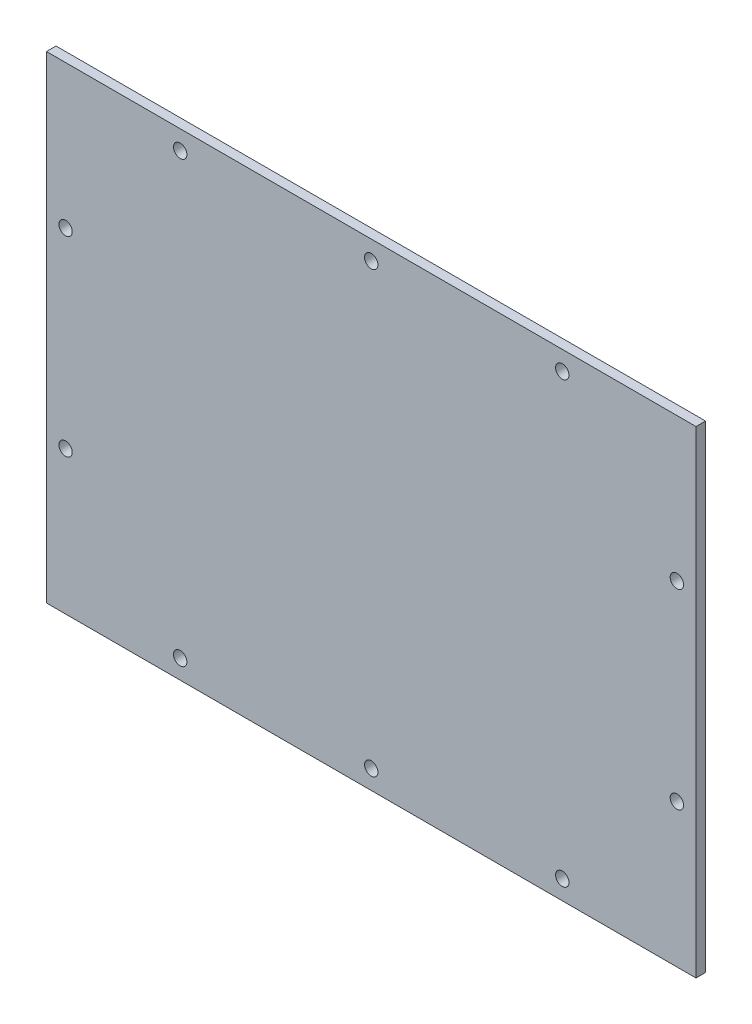
ISO-10303-21;
HEADER;
FILE_DESCRIPTION(('STEP AP214'),'2;1');
FILE_NAME('part.step','',(''),(''),'','','');
FILE_SCHEMA(('AUTOMOTIVE_DESIGN { 1 0 10303 214 1 1 1 1 }'));
ENDSEC;
DATA;
#1=APPLICATION_CONTEXT('core data for automotive mechanical design processes');
#2=APPLICATION_PROTOCOL_DEFINITION('international standard','automotive_design',2000,#1);
#3=PRODUCT_CONTEXT('',#1,'mechanical');
#4=PRODUCT('Part','Part','',(#3));
#5=PRODUCT_RELATED_PRODUCT_CATEGORY('part','',(#4));
#6=PRODUCT_DEFINITION_FORMATION('','',#4);
#7=PRODUCT_DEFINITION_CONTEXT('part definition',#1,'design');
#8=PRODUCT_DEFINITION('design','',#6,#7);
#9=PRODUCT_DEFINITION_SHAPE('','',#8);
#10=(LENGTH_UNIT() NAMED_UNIT(*) SI_UNIT(.MILLI.,.METRE.));
#11=(NAMED_UNIT(*) PLANE_ANGLE_UNIT() SI_UNIT($,.RADIAN.));
#12=(NAMED_UNIT(*) SI_UNIT($,.STERADIAN.) SOLID_ANGLE_UNIT());
#13=UNCERTAINTY_MEASURE_WITH_UNIT(LENGTH_MEASURE(1.E-05),#10,'distance_accuracy_value','');
#14=(GEOMETRIC_REPRESENTATION_CONTEXT(3) GLOBAL_UNCERTAINTY_ASSIGNED_CONTEXT((#13)) GLOBAL_UNIT_ASSIGNED_CONTEXT((#10,
#11,#12)) REPRESENTATION_CONTEXT('',''));
#15=CARTESIAN_POINT('',(0.,0.,0.));
#16=DIRECTION('',(0.,0.,1.));
#17=DIRECTION('',(1.,0.,0.));
#18=AXIS2_PLACEMENT_3D('',#15,#16,#17);
#19=CARTESIAN_POINT('',(0.,0.,2.5));
#20=DIRECTION('',(0.,0.,1.));
#21=DIRECTION('',(-1.,0.,0.));
#22=AXIS2_PLACEMENT_3D('',#19,#20,#21);
#23=PLANE('',#22);
#24=CARTESIAN_POINT('',(100.,-115.,2.5));
#25=DIRECTION('',(0.,0.,-1.));
#26=DIRECTION('',(-1.,0.,0.));
#27=AXIS2_PLACEMENT_3D('',#24,#25,#26);
#28=CIRCLE('',#27,3.50000000000263);
#29=CARTESIAN_POINT('',(96.4999999999974,-115.,2.5));
#30=VERTEX_POINT('',#29);
#31=EDGE_CURVE('E185',#30,#30,#28,.T.);
#32=ORIENTED_EDGE('',*,*,#31,.T.);
#33=EDGE_LOOP('',(#32));
#34=FACE_BOUND('',#33,.T.);
#35=CARTESIAN_POINT('',(-100.000000000002,-115.000000000001,2.5));
#36=DIRECTION('',(0.,0.,-1.));
#37=DIRECTION('',(1.,0.,0.));
#38=AXIS2_PLACEMENT_3D('',#35,#36,#37);
#39=CIRCLE('',#38,3.5);
#40=CARTESIAN_POINT('',(-96.5000000000016,-115.000000000001,2.5));
#41=VERTEX_POINT('',#40);
#42=EDGE_CURVE('E189',#41,#41,#39,.T.);
#43=ORIENTED_EDGE('',*,*,#42,.T.);
#44=EDGE_LOOP('',(#43));
#45=FACE_BOUND('',#44,.T.);
#46=CARTESIAN_POINT('',(-1.54737334057131E-12,-115.000000000003,2.5));
#47=DIRECTION('',(0.,0.,-1.));
#48=DIRECTION('',(1.,0.,0.));
#49=AXIS2_PLACEMENT_3D('',#46,#47,#48);
#50=CIRCLE('',#49,3.49999999999998);
#51=CARTESIAN_POINT('',(3.49999999999844,-115.000000000003,2.5));
#52=VERTEX_POINT('',#51);
#53=EDGE_CURVE('E193',#52,#52,#50,.T.);
#54=ORIENTED_EDGE('',*,*,#53,.T.);
#55=EDGE_LOOP('',(#54));
#56=FACE_BOUND('',#55,.T.);
#57=CARTESIAN_POINT('',(160.,-50.,2.5));
#58=DIRECTION('',(0.,0.,-1.));
#59=DIRECTION('',(-1.,0.,0.));
#60=AXIS2_PLACEMENT_3D('',#57,#58,#59);
#61=CIRCLE('',#60,3.49999999999776);
#62=CARTESIAN_POINT('',(156.500000000002,-50.,2.5));
#63=VERTEX_POINT('',#62);
#64=EDGE_CURVE('E197',#63,#63,#61,.T.);
#65=ORIENTED_EDGE('',*,*,#64,.T.);
#66=EDGE_LOOP('',(#65));
#67=FACE_BOUND('',#66,.T.);
#68=CARTESIAN_POINT('',(-100.,115.,2.5));
#69=DIRECTION('',(0.,0.,-1.));
#70=DIRECTION('',(-1.,0.,0.));
#71=AXIS2_PLACEMENT_3D('',#68,#69,#70);
#72=CIRCLE('',#71,3.50000000000001);
#73=CARTESIAN_POINT('',(-103.5,115.,2.5));
#74=VERTEX_POINT('',#73);
#75=EDGE_CURVE('E201',#74,#74,#72,.T.);
#76=ORIENTED_EDGE('',*,*,#75,.T.);
#77=EDGE_LOOP('',(#76));
#78=FACE_BOUND('',#77,.T.);
#79=CARTESIAN_POINT('',(-160.,50.,2.5));
#80=DIRECTION('',(0.,0.,-1.));
#81=DIRECTION('',(-1.,0.,0.));
#82=AXIS2_PLACEMENT_3D('',#79,#80,#81);
#83=CIRCLE('',#82,3.49999999999999);
#84=CARTESIAN_POINT('',(-163.5,50.,2.5));
#85=VERTEX_POINT('',#84);
#86=EDGE_CURVE('E205',#85,#85,#83,.T.);
#87=ORIENTED_EDGE('',*,*,#86,.T.);
#88=EDGE_LOOP('',(#87));
#89=FACE_BOUND('',#88,.T.);
#90=CARTESIAN_POINT('',(100.,115.,2.5));
#91=DIRECTION('',(0.,0.,-1.));
#92=DIRECTION('',(1.,0.,0.));
#93=AXIS2_PLACEMENT_3D('',#90,#91,#92);
#94=CIRCLE('',#93,3.50000000000001);
#95=CARTESIAN_POINT('',(103.5,115.,2.5));
#96=VERTEX_POINT('',#95);
#97=EDGE_CURVE('E209',#96,#96,#94,.T.);
#98=ORIENTED_EDGE('',*,*,#97,.T.);
#99=EDGE_LOOP('',(#98));
#100=FACE_BOUND('',#99,.T.);
#101=CARTESIAN_POINT('',(-160.,-50.,2.5));
#102=DIRECTION('',(0.,0.,-1.));
#103=DIRECTION('',(1.,0.,0.));
#104=AXIS2_PLACEMENT_3D('',#101,#102,#103);
#105=CIRCLE('',#104,3.49999999999999);
#106=CARTESIAN_POINT('',(-156.5,-50.,2.5));
#107=VERTEX_POINT('',#106);
#108=EDGE_CURVE('E213',#107,#107,#105,.T.);
#109=ORIENTED_EDGE('',*,*,#108,.T.);
#110=EDGE_LOOP('',(#109));
#111=FACE_BOUND('',#110,.T.);
#112=CARTESIAN_POINT('',(160.,50.,2.5));
#113=DIRECTION('',(0.,0.,-1.));
#114=DIRECTION('',(1.,0.,0.));
#115=AXIS2_PLACEMENT_3D('',#112,#113,#114);
#116=CIRCLE('',#115,3.50000000000154);
#117=CARTESIAN_POINT('',(163.500000000002,50.,2.5));
#118=VERTEX_POINT('',#117);
#119=EDGE_CURVE('E217',#118,#118,#116,.T.);
#120=ORIENTED_EDGE('',*,*,#119,.T.);
#121=EDGE_LOOP('',(#120));
#122=FACE_BOUND('',#121,.T.);
#123=CARTESIAN_POINT('',(0.,115.,2.5));
#124=DIRECTION('',(0.,0.,-1.));
#125=DIRECTION('',(-1.,0.,0.));
#126=AXIS2_PLACEMENT_3D('',#123,#124,#125);
#127=CIRCLE('',#126,3.5);
#128=CARTESIAN_POINT('',(-3.49999999999994,115.,2.5));
#129=VERTEX_POINT('',#128);
#130=EDGE_CURVE('E109',#129,#129,#127,.T.);
#131=ORIENTED_EDGE('',*,*,#130,.T.);
#132=EDGE_LOOP('',(#131));
#133=FACE_BOUND('',#132,.T.);
#134=DIRECTION('',(0.,1.,0.));
#135=VECTOR('',#134,1.);
#136=CARTESIAN_POINT('',(170.,-125.,2.5));
#137=LINE('',#136,#135);
#138=CARTESIAN_POINT('',(170.,125.,2.5));
#139=VERTEX_POINT('',#138);
#140=CARTESIAN_POINT('',(170.,-125.,2.5));
#141=VERTEX_POINT('',#140);
#142=EDGE_CURVE('E96',#139,#141,#137,.F.);
#143=ORIENTED_EDGE('',*,*,#142,.F.);
#144=DIRECTION('',(1.,0.,0.));
#145=VECTOR('',#144,1.);
#146=CARTESIAN_POINT('',(-170.,125.,2.5));
#147=LINE('',#146,#145);
#148=CARTESIAN_POINT('',(-170.,125.,2.5));
#149=VERTEX_POINT('',#148);
#150=EDGE_CURVE('E167',#149,#139,#147,.T.);
#151=ORIENTED_EDGE('',*,*,#150,.F.);
#152=DIRECTION('',(0.,1.,0.));
#153=VECTOR('',#152,1.);
#154=CARTESIAN_POINT('',(-170.,-125.,2.5));
#155=LINE('',#154,#153);
#156=CARTESIAN_POINT('',(-170.,-125.,2.5));
#157=VERTEX_POINT('',#156);
#158=EDGE_CURVE('E91',#157,#149,#155,.T.);
#159=ORIENTED_EDGE('',*,*,#158,.F.);
#160=DIRECTION('',(1.,0.,0.));
#161=VECTOR('',#160,1.);
#162=CARTESIAN_POINT('',(-170.,-125.,2.5));
#163=LINE('',#162,#161);
#164=EDGE_CURVE('E83',#141,#157,#163,.F.);
#165=ORIENTED_EDGE('',*,*,#164,.F.);
#166=EDGE_LOOP('',(#143,#151,#159,#165));
#167=FACE_BOUND('',#166,.T.);
#168=ADVANCED_FACE('F40',(#34,#45,#56,#67,#78,#89,#100,#111,#122,#133,#167),#23,.T.);
#169=CARTESIAN_POINT('',(170.,-125.,-2.5));
#170=DIRECTION('',(-1.,0.,0.));
#171=DIRECTION('',(0.,0.,-1.));
#172=AXIS2_PLACEMENT_3D('',#169,#170,#171);
#173=PLANE('',#172);
#174=DIRECTION('',(0.,1.,0.));
#175=VECTOR('',#174,1.);
#176=CARTESIAN_POINT('',(170.,0.,-2.5));
#177=LINE('',#176,#175);
#178=CARTESIAN_POINT('',(170.,125.,-2.5));
#179=VERTEX_POINT('',#178);
#180=CARTESIAN_POINT('',(170.,-125.,-2.5));
#181=VERTEX_POINT('',#180);
#182=EDGE_CURVE('E159',#179,#181,#177,.F.);
#183=ORIENTED_EDGE('',*,*,#182,.F.);
#184=DIRECTION('',(0.,0.,1.));
#185=VECTOR('',#184,1.);
#186=CARTESIAN_POINT('',(170.,125.,-2.5));
#187=LINE('',#186,#185);
#188=EDGE_CURVE('E99',#139,#179,#187,.F.);
#189=ORIENTED_EDGE('',*,*,#188,.F.);
#190=ORIENTED_EDGE('',*,*,#142,.T.);
#191=DIRECTION('',(0.,0.,-1.));
#192=VECTOR('',#191,1.);
#193=CARTESIAN_POINT('',(170.,-125.,-2.5));
#194=LINE('',#193,#192);
#195=EDGE_CURVE('E80',#181,#141,#194,.F.);
#196=ORIENTED_EDGE('',*,*,#195,.F.);
#197=EDGE_LOOP('',(#183,#189,#190,#196));
#198=FACE_BOUND('',#197,.T.);
#199=ADVANCED_FACE('F98',(#198),#173,.F.);
#200=CARTESIAN_POINT('',(-170.,-125.,-2.5));
#201=DIRECTION('',(0.,1.,0.));
#202=DIRECTION('',(0.,0.,-1.));
#203=AXIS2_PLACEMENT_3D('',#200,#201,#202);
#204=PLANE('',#203);
#205=DIRECTION('',(-1.,0.,0.));
#206=VECTOR('',#205,1.);
#207=CARTESIAN_POINT('',(0.,-125.,-2.5));
#208=LINE('',#207,#206);
#209=CARTESIAN_POINT('',(-170.,-125.,-2.5));
#210=VERTEX_POINT('',#209);
#211=EDGE_CURVE('E86',#181,#210,#208,.T.);
#212=ORIENTED_EDGE('',*,*,#211,.F.);
#213=ORIENTED_EDGE('',*,*,#195,.T.);
#214=ORIENTED_EDGE('',*,*,#164,.T.);
#215=DIRECTION('',(0.,0.,1.));
#216=VECTOR('',#215,1.);
#217=CARTESIAN_POINT('',(-170.,-125.,-2.5));
#218=LINE('',#217,#216);
#219=EDGE_CURVE('E75',#210,#157,#218,.T.);
#220=ORIENTED_EDGE('',*,*,#219,.F.);
#221=EDGE_LOOP('',(#212,#213,#214,#220));
#222=FACE_BOUND('',#221,.T.);
#223=ADVANCED_FACE('F82',(#222),#204,.F.);
#224=CARTESIAN_POINT('',(-170.,-125.,-2.5));
#225=DIRECTION('',(1.,0.,0.));
#226=DIRECTION('',(0.,0.,1.));
#227=AXIS2_PLACEMENT_3D('',#224,#225,#226);
#228=PLANE('',#227);
#229=DIRECTION('',(0.,1.,0.));
#230=VECTOR('',#229,1.);
#231=CARTESIAN_POINT('',(-170.,0.,-2.5));
#232=LINE('',#231,#230);
#233=CARTESIAN_POINT('',(-170.,125.,-2.5));
#234=VERTEX_POINT('',#233);
#235=EDGE_CURVE('E49',#210,#234,#232,.T.);
#236=ORIENTED_EDGE('',*,*,#235,.F.);
#237=ORIENTED_EDGE('',*,*,#219,.T.);
#238=ORIENTED_EDGE('',*,*,#158,.T.);
#239=DIRECTION('',(0.,0.,1.));
#240=VECTOR('',#239,1.);
#241=CARTESIAN_POINT('',(-170.,125.,-2.5));
#242=LINE('',#241,#240);
#243=EDGE_CURVE('E164',#234,#149,#242,.T.);
#244=ORIENTED_EDGE('',*,*,#243,.F.);
#245=EDGE_LOOP('',(#236,#237,#238,#244));
#246=FACE_BOUND('',#245,.T.);
#247=ADVANCED_FACE('F170',(#246),#228,.F.);
#248=CARTESIAN_POINT('',(-170.,125.,-2.5));
#249=DIRECTION('',(0.,-1.,0.));
#250=DIRECTION('',(0.,0.,1.));
#251=AXIS2_PLACEMENT_3D('',#248,#249,#250);
#252=PLANE('',#251);
#253=DIRECTION('',(-1.,0.,0.));
#254=VECTOR('',#253,1.);
#255=CARTESIAN_POINT('',(0.,125.,-2.5));
#256=LINE('',#255,#254);
#257=EDGE_CURVE('E11',#234,#179,#256,.F.);
#258=ORIENTED_EDGE('',*,*,#257,.F.);
#259=ORIENTED_EDGE('',*,*,#243,.T.);
#260=ORIENTED_EDGE('',*,*,#150,.T.);
#261=ORIENTED_EDGE('',*,*,#188,.T.);
#262=EDGE_LOOP('',(#258,#259,#260,#261));
#263=FACE_BOUND('',#262,.T.);
#264=ADVANCED_FACE('F138',(#263),#252,.F.);
#265=CARTESIAN_POINT('',(0.,0.,-2.5));
#266=DIRECTION('',(0.,0.,1.));
#267=DIRECTION('',(-1.,0.,0.));
#268=AXIS2_PLACEMENT_3D('',#265,#266,#267);
#269=PLANE('',#268);
#270=CARTESIAN_POINT('',(100.,-115.,-2.5));
#271=DIRECTION('',(0.,0.,-1.));
#272=DIRECTION('',(-1.,0.,0.));
#273=AXIS2_PLACEMENT_3D('',#270,#271,#272);
#274=CIRCLE('',#273,3.50000000000263);
#275=CARTESIAN_POINT('',(96.4999999999974,-115.,-2.5));
#276=VERTEX_POINT('',#275);
#277=EDGE_CURVE('E43',#276,#276,#274,.T.);
#278=ORIENTED_EDGE('',*,*,#277,.F.);
#279=EDGE_LOOP('',(#278));
#280=FACE_BOUND('',#279,.T.);
#281=CARTESIAN_POINT('',(-100.000000000002,-115.000000000001,-2.5));
#282=DIRECTION('',(0.,0.,-1.));
#283=DIRECTION('',(-1.,0.,0.));
#284=AXIS2_PLACEMENT_3D('',#281,#282,#283);
#285=CIRCLE('',#284,3.5);
#286=CARTESIAN_POINT('',(-103.500000000002,-115.000000000001,-2.5));
#287=VERTEX_POINT('',#286);
#288=EDGE_CURVE('E103',#287,#287,#285,.T.);
#289=ORIENTED_EDGE('',*,*,#288,.F.);
#290=EDGE_LOOP('',(#289));
#291=FACE_BOUND('',#290,.T.);
#292=CARTESIAN_POINT('',(-1.54737334057131E-12,-115.000000000003,-2.5));
#293=DIRECTION('',(0.,0.,-1.));
#294=DIRECTION('',(-1.,0.,0.));
#295=AXIS2_PLACEMENT_3D('',#292,#293,#294);
#296=CIRCLE('',#295,3.49999999999998);
#297=CARTESIAN_POINT('',(-3.50000000000153,-115.000000000003,-2.5));
#298=VERTEX_POINT('',#297);
#299=EDGE_CURVE('E127',#298,#298,#296,.T.);
#300=ORIENTED_EDGE('',*,*,#299,.F.);
#301=EDGE_LOOP('',(#300));
#302=FACE_BOUND('',#301,.T.);
#303=CARTESIAN_POINT('',(160.,-50.,-2.5));
#304=DIRECTION('',(0.,0.,-1.));
#305=DIRECTION('',(-1.,0.,0.));
#306=AXIS2_PLACEMENT_3D('',#303,#304,#305);
#307=CIRCLE('',#306,3.49999999999776);
#308=CARTESIAN_POINT('',(156.500000000002,-50.,-2.5));
#309=VERTEX_POINT('',#308);
#310=EDGE_CURVE('E124',#309,#309,#307,.T.);
#311=ORIENTED_EDGE('',*,*,#310,.F.);
#312=EDGE_LOOP('',(#311));
#313=FACE_BOUND('',#312,.T.);
#314=CARTESIAN_POINT('',(-100.,115.,-2.5));
#315=DIRECTION('',(0.,0.,-1.));
#316=DIRECTION('',(-1.,0.,0.));
#317=AXIS2_PLACEMENT_3D('',#314,#315,#316);
#318=CIRCLE('',#317,3.50000000000001);
#319=CARTESIAN_POINT('',(-103.5,115.,-2.5));
#320=VERTEX_POINT('',#319);
#321=EDGE_CURVE('E121',#320,#320,#318,.T.);
#322=ORIENTED_EDGE('',*,*,#321,.F.);
#323=EDGE_LOOP('',(#322));
#324=FACE_BOUND('',#323,.T.);
#325=CARTESIAN_POINT('',(-160.,50.,-2.5));
#326=DIRECTION('',(0.,0.,-1.));
#327=DIRECTION('',(-1.,0.,0.));
#328=AXIS2_PLACEMENT_3D('',#325,#326,#327);
#329=CIRCLE('',#328,3.49999999999999);
#330=CARTESIAN_POINT('',(-163.5,50.,-2.5));
#331=VERTEX_POINT('',#330);
#332=EDGE_CURVE('E118',#331,#331,#329,.T.);
#333=ORIENTED_EDGE('',*,*,#332,.F.);
#334=EDGE_LOOP('',(#333));
#335=FACE_BOUND('',#334,.T.);
#336=CARTESIAN_POINT('',(100.,115.,-2.5));
#337=DIRECTION('',(0.,0.,-1.));
#338=DIRECTION('',(-1.,0.,0.));
#339=AXIS2_PLACEMENT_3D('',#336,#337,#338);
#340=CIRCLE('',#339,3.50000000000001);
#341=CARTESIAN_POINT('',(96.5,115.,-2.5));
#342=VERTEX_POINT('',#341);
#343=EDGE_CURVE('E115',#342,#342,#340,.T.);
#344=ORIENTED_EDGE('',*,*,#343,.F.);
#345=EDGE_LOOP('',(#344));
#346=FACE_BOUND('',#345,.T.);
#347=CARTESIAN_POINT('',(-160.,-50.,-2.5));
#348=DIRECTION('',(0.,0.,-1.));
#349=DIRECTION('',(-1.,0.,0.));
#350=AXIS2_PLACEMENT_3D('',#347,#348,#349);
#351=CIRCLE('',#350,3.49999999999999);
#352=CARTESIAN_POINT('',(-163.5,-50.,-2.5));
#353=VERTEX_POINT('',#352);
#354=EDGE_CURVE('E112',#353,#353,#351,.T.);
#355=ORIENTED_EDGE('',*,*,#354,.F.);
#356=EDGE_LOOP('',(#355));
#357=FACE_BOUND('',#356,.T.);
#358=CARTESIAN_POINT('',(160.,50.,-2.5));
#359=DIRECTION('',(0.,0.,-1.));
#360=DIRECTION('',(-1.,0.,0.));
#361=AXIS2_PLACEMENT_3D('',#358,#359,#360);
#362=CIRCLE('',#361,3.50000000000154);
#363=CARTESIAN_POINT('',(156.499999999998,50.,-2.5));
#364=VERTEX_POINT('',#363);
#365=EDGE_CURVE('E108',#364,#364,#362,.T.);
#366=ORIENTED_EDGE('',*,*,#365,.F.);
#367=EDGE_LOOP('',(#366));
#368=FACE_BOUND('',#367,.T.);
#369=CARTESIAN_POINT('',(0.,115.,-2.5));
#370=DIRECTION('',(0.,0.,-1.));
#371=DIRECTION('',(-1.,0.,0.));
#372=AXIS2_PLACEMENT_3D('',#369,#370,#371);
#373=CIRCLE('',#372,3.5);
#374=CARTESIAN_POINT('',(-3.49999999999994,115.,-2.5));
#375=VERTEX_POINT('',#374);
#376=EDGE_CURVE('E105',#375,#375,#373,.T.);
#377=ORIENTED_EDGE('',*,*,#376,.F.);
#378=EDGE_LOOP('',(#377));
#379=FACE_BOUND('',#378,.T.);
#380=ORIENTED_EDGE('',*,*,#235,.T.);
#381=ORIENTED_EDGE('',*,*,#257,.T.);
#382=ORIENTED_EDGE('',*,*,#182,.T.);
#383=ORIENTED_EDGE('',*,*,#211,.T.);
#384=EDGE_LOOP('',(#380,#381,#382,#383));
#385=FACE_BOUND('',#384,.T.);
#386=ADVANCED_FACE('F134',(#280,#291,#302,#313,#324,#335,#346,#357,#368,#379,#385),#269,.F.);
#387=CARTESIAN_POINT('',(0.,115.,-7.5));
#388=DIRECTION('',(0.,0.,1.));
#389=DIRECTION('',(-1.,0.,0.));
#390=AXIS2_PLACEMENT_3D('',#387,#388,#389);
#391=CYLINDRICAL_SURFACE('',#390,3.5);
#392=ORIENTED_EDGE('',*,*,#130,.F.);
#393=EDGE_LOOP('',(#392));
#394=FACE_BOUND('',#393,.T.);
#395=ORIENTED_EDGE('',*,*,#376,.T.);
#396=EDGE_LOOP('',(#395));
#397=FACE_BOUND('',#396,.T.);
#398=ADVANCED_FACE('F137',(#394,#397),#391,.F.);
#399=CARTESIAN_POINT('',(160.,50.,-7.5));
#400=DIRECTION('',(0.,0.,1.));
#401=DIRECTION('',(-1.,0.,0.));
#402=AXIS2_PLACEMENT_3D('',#399,#400,#401);
#403=CYLINDRICAL_SURFACE('',#402,3.50000000000154);
#404=ORIENTED_EDGE('',*,*,#119,.F.);
#405=EDGE_LOOP('',(#404));
#406=FACE_BOUND('',#405,.T.);
#407=ORIENTED_EDGE('',*,*,#365,.T.);
#408=EDGE_LOOP('',(#407));
#409=FACE_BOUND('',#408,.T.);
#410=ADVANCED_FACE('F232',(#406,#409),#403,.F.);
#411=CARTESIAN_POINT('',(-160.,-50.,-7.5));
#412=DIRECTION('',(0.,0.,1.));
#413=DIRECTION('',(-1.,0.,0.));
#414=AXIS2_PLACEMENT_3D('',#411,#412,#413);
#415=CYLINDRICAL_SURFACE('',#414,3.49999999999999);
#416=ORIENTED_EDGE('',*,*,#108,.F.);
#417=EDGE_LOOP('',(#416));
#418=FACE_BOUND('',#417,.T.);
#419=ORIENTED_EDGE('',*,*,#354,.T.);
#420=EDGE_LOOP('',(#419));
#421=FACE_BOUND('',#420,.T.);
#422=ADVANCED_FACE('F237',(#418,#421),#415,.F.);
#423=CARTESIAN_POINT('',(100.,115.,-7.5));
#424=DIRECTION('',(0.,0.,1.));
#425=DIRECTION('',(-1.,0.,0.));
#426=AXIS2_PLACEMENT_3D('',#423,#424,#425);
#427=CYLINDRICAL_SURFACE('',#426,3.50000000000001);
#428=ORIENTED_EDGE('',*,*,#97,.F.);
#429=EDGE_LOOP('',(#428));
#430=FACE_BOUND('',#429,.T.);
#431=ORIENTED_EDGE('',*,*,#343,.T.);
#432=EDGE_LOOP('',(#431));
#433=FACE_BOUND('',#432,.T.);
#434=ADVANCED_FACE('F245',(#430,#433),#427,.F.);
#435=CARTESIAN_POINT('',(-160.,50.,-7.5));
#436=DIRECTION('',(0.,0.,1.));
#437=DIRECTION('',(-1.,0.,0.));
#438=AXIS2_PLACEMENT_3D('',#435,#436,#437);
#439=CYLINDRICAL_SURFACE('',#438,3.49999999999999);
#440=ORIENTED_EDGE('',*,*,#86,.F.);
#441=EDGE_LOOP('',(#440));
#442=FACE_BOUND('',#441,.T.);
#443=ORIENTED_EDGE('',*,*,#332,.T.);
#444=EDGE_LOOP('',(#443));
#445=FACE_BOUND('',#444,.T.);
#446=ADVANCED_FACE('F241',(#442,#445),#439,.F.);
#447=CARTESIAN_POINT('',(-100.,115.,-7.5));
#448=DIRECTION('',(0.,0.,1.));
#449=DIRECTION('',(-1.,0.,0.));
#450=AXIS2_PLACEMENT_3D('',#447,#448,#449);
#451=CYLINDRICAL_SURFACE('',#450,3.50000000000001);
#452=ORIENTED_EDGE('',*,*,#75,.F.);
#453=EDGE_LOOP('',(#452));
#454=FACE_BOUND('',#453,.T.);
#455=ORIENTED_EDGE('',*,*,#321,.T.);
#456=EDGE_LOOP('',(#455));
#457=FACE_BOUND('',#456,.T.);
#458=ADVANCED_FACE('F244',(#454,#457),#451,.F.);
#459=CARTESIAN_POINT('',(160.,-50.,-7.5));
#460=DIRECTION('',(0.,0.,1.));
#461=DIRECTION('',(-1.,0.,0.));
#462=AXIS2_PLACEMENT_3D('',#459,#460,#461);
#463=CYLINDRICAL_SURFACE('',#462,3.49999999999776);
#464=ORIENTED_EDGE('',*,*,#64,.F.);
#465=EDGE_LOOP('',(#464));
#466=FACE_BOUND('',#465,.T.);
#467=ORIENTED_EDGE('',*,*,#310,.T.);
#468=EDGE_LOOP('',(#467));
#469=FACE_BOUND('',#468,.T.);
#470=ADVANCED_FACE('F249',(#466,#469),#463,.F.);
#471=CARTESIAN_POINT('',(-1.54737334057131E-12,-115.000000000003,-7.5));
#472=DIRECTION('',(0.,0.,1.));
#473=DIRECTION('',(-1.,0.,0.));
#474=AXIS2_PLACEMENT_3D('',#471,#472,#473);
#475=CYLINDRICAL_SURFACE('',#474,3.49999999999998);
#476=ORIENTED_EDGE('',*,*,#53,.F.);
#477=EDGE_LOOP('',(#476));
#478=FACE_BOUND('',#477,.T.);
#479=ORIENTED_EDGE('',*,*,#299,.T.);
#480=EDGE_LOOP('',(#479));
#481=FACE_BOUND('',#480,.T.);
#482=ADVANCED_FACE('F260',(#478,#481),#475,.F.);
#483=CARTESIAN_POINT('',(-100.000000000002,-115.000000000001,-7.5));
#484=DIRECTION('',(0.,0.,1.));
#485=DIRECTION('',(-1.,0.,0.));
#486=AXIS2_PLACEMENT_3D('',#483,#484,#485);
#487=CYLINDRICAL_SURFACE('',#486,3.5);
#488=ORIENTED_EDGE('',*,*,#42,.F.);
#489=EDGE_LOOP('',(#488));
#490=FACE_BOUND('',#489,.T.);
#491=ORIENTED_EDGE('',*,*,#288,.T.);
#492=EDGE_LOOP('',(#491));
#493=FACE_BOUND('',#492,.T.);
#494=ADVANCED_FACE('F132',(#490,#493),#487,.F.);
#495=CARTESIAN_POINT('',(100.,-115.,-7.5));
#496=DIRECTION('',(0.,0.,1.));
#497=DIRECTION('',(-1.,0.,0.));
#498=AXIS2_PLACEMENT_3D('',#495,#496,#497);
#499=CYLINDRICAL_SURFACE('',#498,3.50000000000263);
#500=ORIENTED_EDGE('',*,*,#31,.F.);
#501=EDGE_LOOP('',(#500));
#502=FACE_BOUND('',#501,.T.);
#503=ORIENTED_EDGE('',*,*,#277,.T.);
#504=EDGE_LOOP('',(#503));
#505=FACE_BOUND('',#504,.T.);
#506=ADVANCED_FACE('F259',(#502,#505),#499,.F.);
#507=CLOSED_SHELL('',(#168,#199,#223,#247,#264,#386,#398,#410,#422,#434,#446,#458,#470,#482,
#494,#506));
#508=MANIFOLD_SOLID_BREP('B2',#507);
#509=ADVANCED_BREP_SHAPE_REPRESENTATION('',(#18,#508),#14);
#510=SHAPE_DEFINITION_REPRESENTATION(#9,#509);
ENDSEC;
END-ISO-10303-21;
